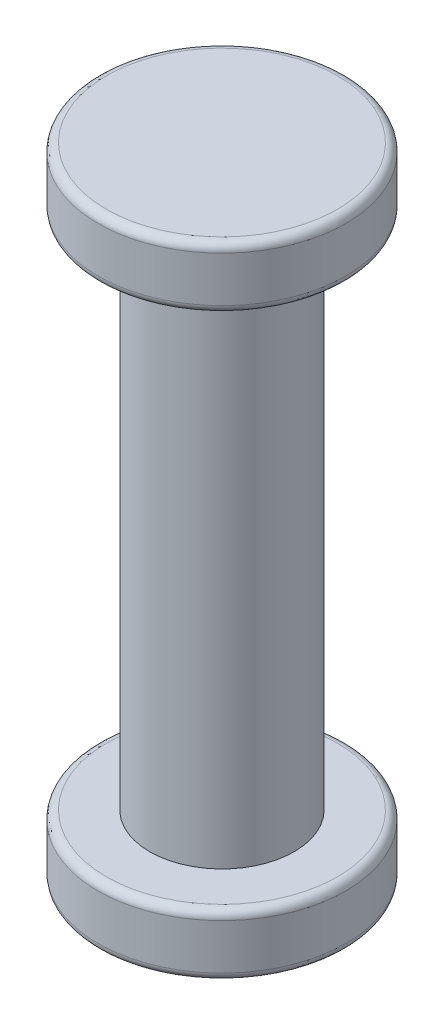
ISO-10303-21;
HEADER;
FILE_DESCRIPTION(('STEP AP214'),'2;1');
FILE_NAME('part.step','',(''),(''),'','','');
FILE_SCHEMA(('AUTOMOTIVE_DESIGN { 1 0 10303 214 1 1 1 1 }'));
ENDSEC;
DATA;
#1=APPLICATION_CONTEXT('core data for automotive mechanical design processes');
#2=APPLICATION_PROTOCOL_DEFINITION('international standard','automotive_design',2000,#1);
#3=PRODUCT_CONTEXT('',#1,'mechanical');
#4=PRODUCT('Part','Part','',(#3));
#5=PRODUCT_RELATED_PRODUCT_CATEGORY('part','',(#4));
#6=PRODUCT_DEFINITION_FORMATION('','',#4);
#7=PRODUCT_DEFINITION_CONTEXT('part definition',#1,'design');
#8=PRODUCT_DEFINITION('design','',#6,#7);
#9=PRODUCT_DEFINITION_SHAPE('','',#8);
#10=(LENGTH_UNIT() NAMED_UNIT(*) SI_UNIT(.MILLI.,.METRE.));
#11=(NAMED_UNIT(*) PLANE_ANGLE_UNIT() SI_UNIT($,.RADIAN.));
#12=(NAMED_UNIT(*) SI_UNIT($,.STERADIAN.) SOLID_ANGLE_UNIT());
#13=UNCERTAINTY_MEASURE_WITH_UNIT(LENGTH_MEASURE(1.E-05),#10,'distance_accuracy_value','');
#14=(GEOMETRIC_REPRESENTATION_CONTEXT(3) GLOBAL_UNCERTAINTY_ASSIGNED_CONTEXT((#13)) GLOBAL_UNIT_ASSIGNED_CONTEXT((#10,
#11,#12)) REPRESENTATION_CONTEXT('',''));
#15=CARTESIAN_POINT('',(0.,0.,0.));
#16=DIRECTION('',(0.,0.,1.));
#17=DIRECTION('',(1.,0.,0.));
#18=AXIS2_PLACEMENT_3D('',#15,#16,#17);
#19=CARTESIAN_POINT('',(0.,6.25,0.));
#20=DIRECTION('',(0.,-1.,0.));
#21=DIRECTION('',(0.,0.,-1.));
#22=AXIS2_PLACEMENT_3D('',#19,#20,#21);
#23=CYLINDRICAL_SURFACE('',#22,1.75);
#24=CARTESIAN_POINT('',(0.,6.25,0.));
#25=DIRECTION('',(0.,1.,0.));
#26=DIRECTION('',(0.,0.,1.));
#27=AXIS2_PLACEMENT_3D('',#24,#25,#26);
#28=CIRCLE('',#27,1.75);
#29=CARTESIAN_POINT('',(0.,6.25,1.75));
#30=VERTEX_POINT('',#29);
#31=EDGE_CURVE('E10',#30,#30,#28,.T.);
#32=ORIENTED_EDGE('',*,*,#31,.F.);
#33=EDGE_LOOP('',(#32));
#34=FACE_BOUND('',#33,.T.);
#35=CARTESIAN_POINT('',(0.,-6.25,0.));
#36=DIRECTION('',(0.,1.,0.));
#37=DIRECTION('',(0.,0.,1.));
#38=AXIS2_PLACEMENT_3D('',#35,#36,#37);
#39=CIRCLE('',#38,1.75);
#40=CARTESIAN_POINT('',(0.,-6.25,1.75));
#41=VERTEX_POINT('',#40);
#42=EDGE_CURVE('E70',#41,#41,#39,.T.);
#43=ORIENTED_EDGE('',*,*,#42,.T.);
#44=EDGE_LOOP('',(#43));
#45=FACE_BOUND('',#44,.T.);
#46=ADVANCED_FACE('F43',(#34,#45),#23,.T.);
#47=CARTESIAN_POINT('',(0.,-7.75,0.));
#48=DIRECTION('',(0.,-1.,0.));
#49=DIRECTION('',(0.,0.,-1.));
#50=AXIS2_PLACEMENT_3D('',#47,#48,#49);
#51=CYLINDRICAL_SURFACE('',#50,3.);
#52=CARTESIAN_POINT('',(0.,6.45,0.));
#53=DIRECTION('',(0.,-1.,0.));
#54=DIRECTION('',(0.,0.,-1.));
#55=AXIS2_PLACEMENT_3D('',#52,#53,#54);
#56=CIRCLE('',#55,3.);
#57=CARTESIAN_POINT('',(0.,6.45,-3.));
#58=VERTEX_POINT('',#57);
#59=EDGE_CURVE('E50',#58,#58,#56,.T.);
#60=ORIENTED_EDGE('',*,*,#59,.F.);
#61=EDGE_LOOP('',(#60));
#62=FACE_BOUND('',#61,.T.);
#63=CARTESIAN_POINT('',(0.,7.55,0.));
#64=DIRECTION('',(0.,-1.,0.));
#65=DIRECTION('',(0.,0.,-1.));
#66=AXIS2_PLACEMENT_3D('',#63,#64,#65);
#67=CIRCLE('',#66,3.);
#68=CARTESIAN_POINT('',(0.,7.55,-3.));
#69=VERTEX_POINT('',#68);
#70=EDGE_CURVE('E66',#69,#69,#67,.T.);
#71=ORIENTED_EDGE('',*,*,#70,.T.);
#72=EDGE_LOOP('',(#71));
#73=FACE_BOUND('',#72,.T.);
#74=ADVANCED_FACE('F107',(#62,#73),#51,.T.);
#75=CARTESIAN_POINT('',(0.,6.45,0.));
#76=DIRECTION('',(0.,-1.,0.));
#77=DIRECTION('',(0.,0.,-1.));
#78=AXIS2_PLACEMENT_3D('',#75,#76,#77);
#79=TOROIDAL_SURFACE('',#78,2.8,0.2);
#80=CARTESIAN_POINT('',(0.,6.25,0.));
#81=DIRECTION('',(0.,-1.,0.));
#82=DIRECTION('',(0.,0.,-1.));
#83=AXIS2_PLACEMENT_3D('',#80,#81,#82);
#84=CIRCLE('',#83,2.8);
#85=CARTESIAN_POINT('',(0.,6.25,-2.8));
#86=VERTEX_POINT('',#85);
#87=EDGE_CURVE('E55',#86,#86,#84,.T.);
#88=ORIENTED_EDGE('',*,*,#87,.F.);
#89=EDGE_LOOP('',(#88));
#90=FACE_BOUND('',#89,.T.);
#91=ORIENTED_EDGE('',*,*,#59,.T.);
#92=EDGE_LOOP('',(#91));
#93=FACE_BOUND('',#92,.T.);
#94=ADVANCED_FACE('F112',(#90,#93),#79,.T.);
#95=CARTESIAN_POINT('',(0.,6.25,0.));
#96=DIRECTION('',(0.,1.,0.));
#97=DIRECTION('',(0.,0.,1.));
#98=AXIS2_PLACEMENT_3D('',#95,#96,#97);
#99=PLANE('',#98);
#100=ORIENTED_EDGE('',*,*,#31,.T.);
#101=EDGE_LOOP('',(#100));
#102=FACE_BOUND('',#101,.T.);
#103=ORIENTED_EDGE('',*,*,#87,.T.);
#104=EDGE_LOOP('',(#103));
#105=FACE_BOUND('',#104,.T.);
#106=ADVANCED_FACE('F118',(#102,#105),#99,.F.);
#107=CARTESIAN_POINT('',(0.,7.75,0.));
#108=DIRECTION('',(0.,-1.,0.));
#109=DIRECTION('',(0.,0.,-1.));
#110=AXIS2_PLACEMENT_3D('',#107,#108,#109);
#111=PLANE('',#110);
#112=CARTESIAN_POINT('',(0.,7.75,0.));
#113=DIRECTION('',(0.,-1.,0.));
#114=DIRECTION('',(0.,0.,-1.));
#115=AXIS2_PLACEMENT_3D('',#112,#113,#114);
#116=CIRCLE('',#115,2.8);
#117=CARTESIAN_POINT('',(0.,7.75,-2.8));
#118=VERTEX_POINT('',#117);
#119=EDGE_CURVE('E60',#118,#118,#116,.T.);
#120=ORIENTED_EDGE('',*,*,#119,.F.);
#121=EDGE_LOOP('',(#120));
#122=FACE_BOUND('',#121,.T.);
#123=ADVANCED_FACE('F125',(#122),#111,.F.);
#124=CARTESIAN_POINT('',(0.,7.55,0.));
#125=DIRECTION('',(0.,-1.,0.));
#126=DIRECTION('',(0.,0.,-1.));
#127=AXIS2_PLACEMENT_3D('',#124,#125,#126);
#128=TOROIDAL_SURFACE('',#127,2.8,0.2);
#129=ORIENTED_EDGE('',*,*,#70,.F.);
#130=EDGE_LOOP('',(#129));
#131=FACE_BOUND('',#130,.T.);
#132=ORIENTED_EDGE('',*,*,#119,.T.);
#133=EDGE_LOOP('',(#132));
#134=FACE_BOUND('',#133,.T.);
#135=ADVANCED_FACE('F128',(#131,#134),#128,.T.);
#136=CARTESIAN_POINT('',(0.,-6.45,0.));
#137=DIRECTION('',(0.,-1.,0.));
#138=DIRECTION('',(0.,0.,-1.));
#139=AXIS2_PLACEMENT_3D('',#136,#137,#138);
#140=TOROIDAL_SURFACE('',#139,2.8,0.2);
#141=CARTESIAN_POINT('',(0.,-6.25,0.));
#142=DIRECTION('',(0.,-1.,0.));
#143=DIRECTION('',(0.,0.,-1.));
#144=AXIS2_PLACEMENT_3D('',#141,#142,#143);
#145=CIRCLE('',#144,2.8);
#146=CARTESIAN_POINT('',(0.,-6.25,-2.8));
#147=VERTEX_POINT('',#146);
#148=EDGE_CURVE('E86',#147,#147,#145,.T.);
#149=ORIENTED_EDGE('',*,*,#148,.T.);
#150=EDGE_LOOP('',(#149));
#151=FACE_BOUND('',#150,.T.);
#152=CARTESIAN_POINT('',(0.,-6.45,0.));
#153=DIRECTION('',(0.,-1.,0.));
#154=DIRECTION('',(0.,0.,-1.));
#155=AXIS2_PLACEMENT_3D('',#152,#153,#154);
#156=CIRCLE('',#155,3.);
#157=CARTESIAN_POINT('',(0.,-6.45,-3.));
#158=VERTEX_POINT('',#157);
#159=EDGE_CURVE('E74',#158,#158,#156,.T.);
#160=ORIENTED_EDGE('',*,*,#159,.F.);
#161=EDGE_LOOP('',(#160));
#162=FACE_BOUND('',#161,.T.);
#163=ADVANCED_FACE('F91',(#151,#162),#140,.T.);
#164=CARTESIAN_POINT('',(0.,-7.75,0.));
#165=DIRECTION('',(0.,-1.,0.));
#166=DIRECTION('',(0.,0.,-1.));
#167=AXIS2_PLACEMENT_3D('',#164,#165,#166);
#168=CYLINDRICAL_SURFACE('',#167,3.);
#169=ORIENTED_EDGE('',*,*,#159,.T.);
#170=EDGE_LOOP('',(#169));
#171=FACE_BOUND('',#170,.T.);
#172=CARTESIAN_POINT('',(0.,-7.55,0.));
#173=DIRECTION('',(0.,-1.,0.));
#174=DIRECTION('',(0.,0.,-1.));
#175=AXIS2_PLACEMENT_3D('',#172,#173,#174);
#176=CIRCLE('',#175,3.);
#177=CARTESIAN_POINT('',(0.,-7.55,-3.));
#178=VERTEX_POINT('',#177);
#179=EDGE_CURVE('E78',#178,#178,#176,.T.);
#180=ORIENTED_EDGE('',*,*,#179,.F.);
#181=EDGE_LOOP('',(#180));
#182=FACE_BOUND('',#181,.T.);
#183=ADVANCED_FACE('F135',(#171,#182),#168,.T.);
#184=CARTESIAN_POINT('',(0.,-7.55,0.));
#185=DIRECTION('',(0.,-1.,0.));
#186=DIRECTION('',(0.,0.,-1.));
#187=AXIS2_PLACEMENT_3D('',#184,#185,#186);
#188=TOROIDAL_SURFACE('',#187,2.8,0.2);
#189=CARTESIAN_POINT('',(0.,-7.75,0.));
#190=DIRECTION('',(0.,-1.,0.));
#191=DIRECTION('',(0.,0.,-1.));
#192=AXIS2_PLACEMENT_3D('',#189,#190,#191);
#193=CIRCLE('',#192,2.8);
#194=CARTESIAN_POINT('',(0.,-7.75,-2.8));
#195=VERTEX_POINT('',#194);
#196=EDGE_CURVE('E82',#195,#195,#193,.T.);
#197=ORIENTED_EDGE('',*,*,#196,.F.);
#198=EDGE_LOOP('',(#197));
#199=FACE_BOUND('',#198,.T.);
#200=ORIENTED_EDGE('',*,*,#179,.T.);
#201=EDGE_LOOP('',(#200));
#202=FACE_BOUND('',#201,.T.);
#203=ADVANCED_FACE('F102',(#199,#202),#188,.T.);
#204=CARTESIAN_POINT('',(0.,-7.75,0.));
#205=DIRECTION('',(0.,-1.,0.));
#206=DIRECTION('',(0.,0.,-1.));
#207=AXIS2_PLACEMENT_3D('',#204,#205,#206);
#208=PLANE('',#207);
#209=ORIENTED_EDGE('',*,*,#196,.T.);
#210=EDGE_LOOP('',(#209));
#211=FACE_BOUND('',#210,.T.);
#212=ADVANCED_FACE('F96',(#211),#208,.T.);
#213=CARTESIAN_POINT('',(0.,-6.25,0.));
#214=DIRECTION('',(0.,1.,0.));
#215=DIRECTION('',(0.,0.,1.));
#216=AXIS2_PLACEMENT_3D('',#213,#214,#215);
#217=PLANE('',#216);
#218=ORIENTED_EDGE('',*,*,#42,.F.);
#219=EDGE_LOOP('',(#218));
#220=FACE_BOUND('',#219,.T.);
#221=ORIENTED_EDGE('',*,*,#148,.F.);
#222=EDGE_LOOP('',(#221));
#223=FACE_BOUND('',#222,.T.);
#224=ADVANCED_FACE('F94',(#220,#223),#217,.T.);
#225=CLOSED_SHELL('',(#46,#74,#94,#106,#123,#135,#163,#183,#203,#212,#224));
#226=MANIFOLD_SOLID_BREP('B2',#225);
#227=ADVANCED_BREP_SHAPE_REPRESENTATION('',(#18,#226),#14);
#228=SHAPE_DEFINITION_REPRESENTATION(#9,#227);
ENDSEC;
END-ISO-10303-21;
